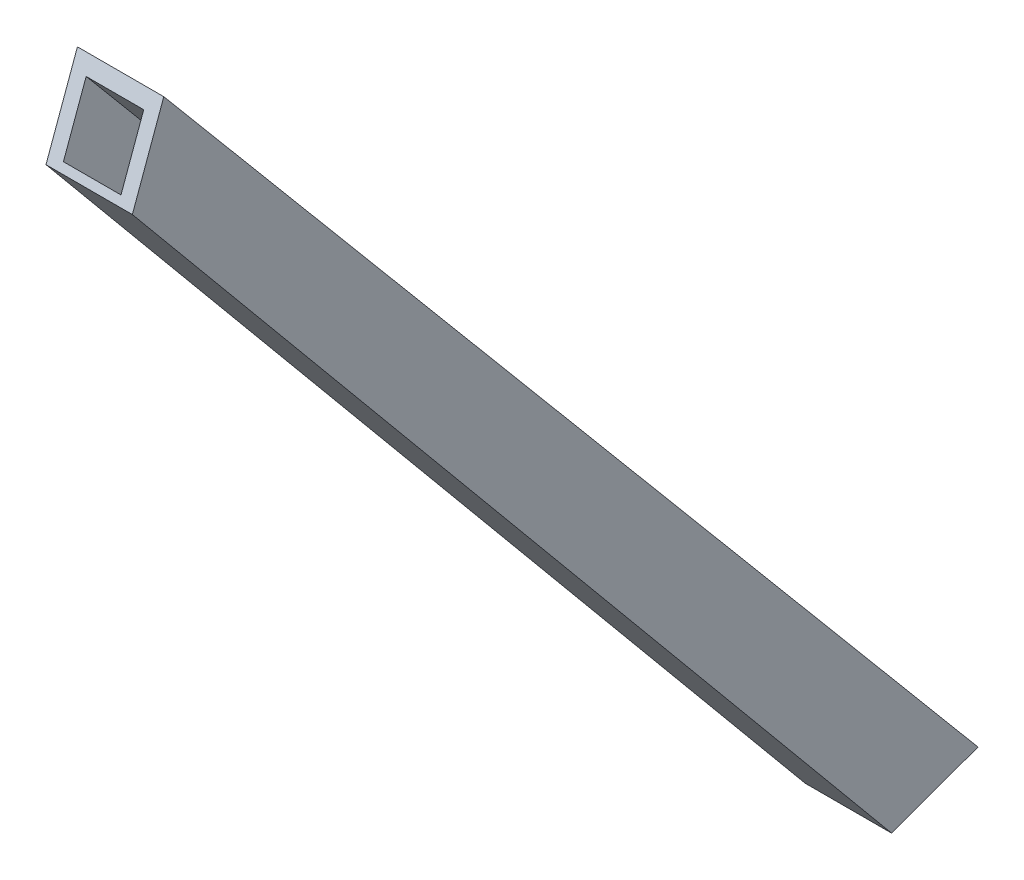
ISO-10303-21;
HEADER;
FILE_DESCRIPTION(('STEP AP214'),'2;1');
FILE_NAME('part.step','',(''),(''),'','','');
FILE_SCHEMA(('AUTOMOTIVE_DESIGN { 1 0 10303 214 1 1 1 1 }'));
ENDSEC;
DATA;
#1=APPLICATION_CONTEXT('core data for automotive mechanical design processes');
#2=APPLICATION_PROTOCOL_DEFINITION('international standard','automotive_design',2000,#1);
#3=PRODUCT_CONTEXT('',#1,'mechanical');
#4=PRODUCT('Part','Part','',(#3));
#5=PRODUCT_RELATED_PRODUCT_CATEGORY('part','',(#4));
#6=PRODUCT_DEFINITION_FORMATION('','',#4);
#7=PRODUCT_DEFINITION_CONTEXT('part definition',#1,'design');
#8=PRODUCT_DEFINITION('design','',#6,#7);
#9=PRODUCT_DEFINITION_SHAPE('','',#8);
#10=(LENGTH_UNIT() NAMED_UNIT(*) SI_UNIT(.MILLI.,.METRE.));
#11=(NAMED_UNIT(*) PLANE_ANGLE_UNIT() SI_UNIT($,.RADIAN.));
#12=(NAMED_UNIT(*) SI_UNIT($,.STERADIAN.) SOLID_ANGLE_UNIT());
#13=UNCERTAINTY_MEASURE_WITH_UNIT(LENGTH_MEASURE(1.E-05),#10,'distance_accuracy_value','');
#14=(GEOMETRIC_REPRESENTATION_CONTEXT(3) GLOBAL_UNCERTAINTY_ASSIGNED_CONTEXT((#13)) GLOBAL_UNIT_ASSIGNED_CONTEXT((#10,
#11,#12)) REPRESENTATION_CONTEXT('',''));
#15=CARTESIAN_POINT('',(0.,0.,0.));
#16=DIRECTION('',(0.,0.,1.));
#17=DIRECTION('',(1.,0.,0.));
#18=AXIS2_PLACEMENT_3D('',#15,#16,#17);
#19=CARTESIAN_POINT('',(19.05,-198.741450370207,-249.444858146427));
#20=DIRECTION('',(0.,0.638416232044862,-0.769691311281114));
#21=DIRECTION('',(0.,0.769691311281114,0.638416232044862));
#22=AXIS2_PLACEMENT_3D('',#19,#20,#21);
#23=PLANE('',#22);
#24=DIRECTION('',(0.,-0.769691311281114,-0.638416232044862));
#25=VECTOR('',#24,1.);
#26=CARTESIAN_POINT('',(0.,-198.741450370207,-249.444858146427));
#27=LINE('',#26,#25);
#28=CARTESIAN_POINT('',(0.,3.175,-81.9663670372294));
#29=VERTEX_POINT('',#28);
#30=CARTESIAN_POINT('',(0.,-198.741450370207,-249.444858146427));
#31=VERTEX_POINT('',#30);
#32=EDGE_CURVE('E121',#29,#31,#27,.T.);
#33=ORIENTED_EDGE('',*,*,#32,.T.);
#34=DIRECTION('',(-1.,0.,0.));
#35=VECTOR('',#34,1.);
#36=CARTESIAN_POINT('',(19.05,-198.741450370207,-249.444858146427));
#37=LINE('',#36,#35);
#38=CARTESIAN_POINT('',(19.05,-198.741450370207,-249.444858146427));
#39=VERTEX_POINT('',#38);
#40=EDGE_CURVE('E149',#39,#31,#37,.T.);
#41=ORIENTED_EDGE('',*,*,#40,.F.);
#42=DIRECTION('',(0.,-0.769691311281114,-0.638416232044862));
#43=VECTOR('',#42,1.);
#44=CARTESIAN_POINT('',(19.05,-198.741450370207,-249.444858146427));
#45=LINE('',#44,#43);
#46=CARTESIAN_POINT('',(19.05,3.175,-81.9663670372294));
#47=VERTEX_POINT('',#46);
#48=EDGE_CURVE('E122',#47,#39,#45,.T.);
#49=ORIENTED_EDGE('',*,*,#48,.F.);
#50=DIRECTION('',(-1.,0.,0.));
#51=VECTOR('',#50,1.);
#52=CARTESIAN_POINT('',(19.05,3.175,-81.9663670372294));
#53=LINE('',#52,#51);
#54=EDGE_CURVE('E132',#47,#29,#53,.T.);
#55=ORIENTED_EDGE('',*,*,#54,.T.);
#56=EDGE_LOOP('',(#33,#41,#49,#55));
#57=FACE_BOUND('',#56,.T.);
#58=ADVANCED_FACE('F33',(#57),#23,.F.);
#59=CARTESIAN_POINT('',(19.05,-198.741450370207,-249.444858146427));
#60=DIRECTION('',(0.,0.93969262078591,0.342020143325665));
#61=DIRECTION('',(0.,-0.342020143325665,0.93969262078591));
#62=AXIS2_PLACEMENT_3D('',#59,#60,#61);
#63=PLANE('',#62);
#64=DIRECTION('',(1.,0.,0.));
#65=VECTOR('',#64,1.);
#66=CARTESIAN_POINT('',(19.05,-197.585844876412,-252.619858146427));
#67=LINE('',#66,#65);
#68=CARTESIAN_POINT('',(3.175,-197.585844876412,-252.619858146427));
#69=VERTEX_POINT('',#68);
#70=CARTESIAN_POINT('',(15.875,-197.585844876412,-252.619858146427));
#71=VERTEX_POINT('',#70);
#72=EDGE_CURVE('E94',#69,#71,#67,.T.);
#73=ORIENTED_EDGE('',*,*,#72,.T.);
#74=DIRECTION('',(0.,0.342020143325665,-0.93969262078591));
#75=VECTOR('',#74,1.);
#76=CARTESIAN_POINT('',(15.875,-198.741450370207,-249.444858146427));
#77=LINE('',#76,#75);
#78=CARTESIAN_POINT('',(15.875,-192.963422901231,-265.319858146427));
#79=VERTEX_POINT('',#78);
#80=EDGE_CURVE('E116',#71,#79,#77,.T.);
#81=ORIENTED_EDGE('',*,*,#80,.T.);
#82=DIRECTION('',(-1.,0.,0.));
#83=VECTOR('',#82,1.);
#84=CARTESIAN_POINT('',(19.05,-192.963422901231,-265.319858146427));
#85=LINE('',#84,#83);
#86=CARTESIAN_POINT('',(3.175,-192.963422901231,-265.319858146427));
#87=VERTEX_POINT('',#86);
#88=EDGE_CURVE('E114',#79,#87,#85,.T.);
#89=ORIENTED_EDGE('',*,*,#88,.T.);
#90=DIRECTION('',(0.,-0.342020143325665,0.93969262078591));
#91=VECTOR('',#90,1.);
#92=CARTESIAN_POINT('',(3.175,-198.741450370207,-249.444858146427));
#93=LINE('',#92,#91);
#94=EDGE_CURVE('E99',#87,#69,#93,.T.);
#95=ORIENTED_EDGE('',*,*,#94,.T.);
#96=EDGE_LOOP('',(#73,#81,#89,#95));
#97=FACE_BOUND('',#96,.T.);
#98=DIRECTION('',(0.,0.342020143325665,-0.93969262078591));
#99=VECTOR('',#98,1.);
#100=CARTESIAN_POINT('',(0.,-198.741450370207,-249.444858146427));
#101=LINE('',#100,#99);
#102=CARTESIAN_POINT('',(0.,-191.807817407436,-268.494858146427));
#103=VERTEX_POINT('',#102);
#104=EDGE_CURVE('E135',#31,#103,#101,.T.);
#105=ORIENTED_EDGE('',*,*,#104,.T.);
#106=DIRECTION('',(-1.,0.,0.));
#107=VECTOR('',#106,1.);
#108=CARTESIAN_POINT('',(19.05,-191.807817407436,-268.494858146427));
#109=LINE('',#108,#107);
#110=CARTESIAN_POINT('',(19.05,-191.807817407436,-268.494858146427));
#111=VERTEX_POINT('',#110);
#112=EDGE_CURVE('E146',#111,#103,#109,.T.);
#113=ORIENTED_EDGE('',*,*,#112,.F.);
#114=DIRECTION('',(0.,0.342020143325665,-0.93969262078591));
#115=VECTOR('',#114,1.);
#116=CARTESIAN_POINT('',(19.05,-198.741450370207,-249.444858146427));
#117=LINE('',#116,#115);
#118=EDGE_CURVE('E125',#39,#111,#117,.T.);
#119=ORIENTED_EDGE('',*,*,#118,.F.);
#120=ORIENTED_EDGE('',*,*,#40,.T.);
#121=EDGE_LOOP('',(#105,#113,#119,#120));
#122=FACE_BOUND('',#121,.T.);
#123=ADVANCED_FACE('F112',(#97,#122),#63,.F.);
#124=CARTESIAN_POINT('',(19.05,15.420103964529,-94.6099857535639));
#125=DIRECTION('',(0.,-0.642787609686569,0.766044443118953));
#126=DIRECTION('',(0.,-0.766044443118953,-0.642787609686569));
#127=AXIS2_PLACEMENT_3D('',#124,#125,#126);
#128=PLANE('',#127);
#129=DIRECTION('',(0.,0.766044443118953,0.642787609686569));
#130=VECTOR('',#129,1.);
#131=CARTESIAN_POINT('',(0.,15.420103964529,-94.6099857535639));
#132=LINE('',#131,#130);
#133=CARTESIAN_POINT('',(0.,22.225,-88.9));
#134=VERTEX_POINT('',#133);
#135=EDGE_CURVE('E138',#103,#134,#132,.T.);
#136=ORIENTED_EDGE('',*,*,#135,.T.);
#137=DIRECTION('',(-1.,0.,0.));
#138=VECTOR('',#137,1.);
#139=CARTESIAN_POINT('',(19.05,22.225,-88.9));
#140=LINE('',#139,#138);
#141=CARTESIAN_POINT('',(19.05,22.225,-88.9));
#142=VERTEX_POINT('',#141);
#143=EDGE_CURVE('E143',#142,#134,#140,.T.);
#144=ORIENTED_EDGE('',*,*,#143,.F.);
#145=DIRECTION('',(0.,0.766044443118954,0.642787609686568));
#146=VECTOR('',#145,1.);
#147=CARTESIAN_POINT('',(19.05,15.420103964529,-94.6099857535639));
#148=LINE('',#147,#146);
#149=EDGE_CURVE('E128',#111,#142,#148,.T.);
#150=ORIENTED_EDGE('',*,*,#149,.F.);
#151=ORIENTED_EDGE('',*,*,#112,.T.);
#152=EDGE_LOOP('',(#136,#144,#150,#151));
#153=FACE_BOUND('',#152,.T.);
#154=ADVANCED_FACE('F184',(#153),#128,.F.);
#155=CARTESIAN_POINT('',(19.05,22.225,-88.9));
#156=DIRECTION('',(0.,-0.342020143325644,-0.939692620785917));
#157=DIRECTION('',(0.,0.939692620785918,-0.342020143325644));
#158=AXIS2_PLACEMENT_3D('',#155,#156,#157);
#159=PLANE('',#158);
#160=DIRECTION('',(1.,0.,0.));
#161=VECTOR('',#160,1.);
#162=CARTESIAN_POINT('',(19.05,18.7799231489541,-87.6460945714598));
#163=LINE('',#162,#161);
#164=CARTESIAN_POINT('',(3.175,18.7799231489541,-87.6460945714598));
#165=VERTEX_POINT('',#164);
#166=CARTESIAN_POINT('',(15.875,18.7799231489541,-87.6460945714598));
#167=VERTEX_POINT('',#166);
#168=EDGE_CURVE('E40',#165,#167,#163,.T.);
#169=ORIENTED_EDGE('',*,*,#168,.T.);
#170=DIRECTION('',(0.,-0.939692620785918,0.342020143325644));
#171=VECTOR('',#170,1.);
#172=CARTESIAN_POINT('',(15.875,22.225,-88.9));
#173=LINE('',#172,#171);
#174=CARTESIAN_POINT('',(15.875,4.99961574477128,-82.6304728572996));
#175=VERTEX_POINT('',#174);
#176=EDGE_CURVE('E11',#167,#175,#173,.T.);
#177=ORIENTED_EDGE('',*,*,#176,.T.);
#178=DIRECTION('',(-1.,0.,0.));
#179=VECTOR('',#178,1.);
#180=CARTESIAN_POINT('',(19.05,4.99961574477128,-82.6304728572996));
#181=LINE('',#180,#179);
#182=CARTESIAN_POINT('',(3.175,4.99961574477128,-82.6304728572996));
#183=VERTEX_POINT('',#182);
#184=EDGE_CURVE('E152',#175,#183,#181,.T.);
#185=ORIENTED_EDGE('',*,*,#184,.T.);
#186=DIRECTION('',(0.,0.939692620785918,-0.342020143325644));
#187=VECTOR('',#186,1.);
#188=CARTESIAN_POINT('',(3.175,22.225,-88.9));
#189=LINE('',#188,#187);
#190=EDGE_CURVE('E107',#183,#165,#189,.T.);
#191=ORIENTED_EDGE('',*,*,#190,.T.);
#192=EDGE_LOOP('',(#169,#177,#185,#191));
#193=FACE_BOUND('',#192,.T.);
#194=DIRECTION('',(0.,-0.939692620785917,0.342020143325644));
#195=VECTOR('',#194,1.);
#196=CARTESIAN_POINT('',(0.,22.225,-88.9));
#197=LINE('',#196,#195);
#198=EDGE_CURVE('E126',#134,#29,#197,.T.);
#199=ORIENTED_EDGE('',*,*,#198,.T.);
#200=ORIENTED_EDGE('',*,*,#54,.F.);
#201=DIRECTION('',(0.,-0.939692620785917,0.342020143325644));
#202=VECTOR('',#201,1.);
#203=CARTESIAN_POINT('',(19.05,22.225,-88.9));
#204=LINE('',#203,#202);
#205=EDGE_CURVE('E130',#142,#47,#204,.T.);
#206=ORIENTED_EDGE('',*,*,#205,.F.);
#207=ORIENTED_EDGE('',*,*,#143,.T.);
#208=EDGE_LOOP('',(#199,#200,#206,#207));
#209=FACE_BOUND('',#208,.T.);
#210=ADVANCED_FACE('F156',(#193,#209),#159,.F.);
#211=CARTESIAN_POINT('',(19.05,0.,0.));
#212=DIRECTION('',(-1.,0.,0.));
#213=DIRECTION('',(0.,0.,1.));
#214=AXIS2_PLACEMENT_3D('',#211,#212,#213);
#215=PLANE('',#214);
#216=ORIENTED_EDGE('',*,*,#48,.T.);
#217=ORIENTED_EDGE('',*,*,#118,.T.);
#218=ORIENTED_EDGE('',*,*,#149,.T.);
#219=ORIENTED_EDGE('',*,*,#205,.T.);
#220=EDGE_LOOP('',(#216,#217,#218,#219));
#221=FACE_BOUND('',#220,.T.);
#222=ADVANCED_FACE('F174',(#221),#215,.F.);
#223=CARTESIAN_POINT('',(0.,0.,0.));
#224=DIRECTION('',(-1.,0.,0.));
#225=DIRECTION('',(0.,0.,1.));
#226=AXIS2_PLACEMENT_3D('',#223,#224,#225);
#227=PLANE('',#226);
#228=ORIENTED_EDGE('',*,*,#32,.F.);
#229=ORIENTED_EDGE('',*,*,#198,.F.);
#230=ORIENTED_EDGE('',*,*,#135,.F.);
#231=ORIENTED_EDGE('',*,*,#104,.F.);
#232=EDGE_LOOP('',(#228,#229,#230,#231));
#233=FACE_BOUND('',#232,.T.);
#234=ADVANCED_FACE('F167',(#233),#227,.T.);
#235=CARTESIAN_POINT('',(15.875,15.4348944453644,-73.8742343483991));
#236=DIRECTION('',(1.,0.,0.));
#237=DIRECTION('',(0.,0.,-1.));
#238=AXIS2_PLACEMENT_3D('',#235,#236,#237);
#239=PLANE('',#238);
#240=DIRECTION('',(0.,-0.766044443118953,-0.642787609686569));
#241=VECTOR('',#240,1.);
#242=CARTESIAN_POINT('',(15.875,15.4348944453644,-73.8742343483991));
#243=LINE('',#242,#241);
#244=EDGE_CURVE('E47',#175,#71,#243,.T.);
#245=ORIENTED_EDGE('',*,*,#244,.F.);
#246=ORIENTED_EDGE('',*,*,#176,.F.);
#247=DIRECTION('',(0.,-0.766044443118953,-0.642787609686569));
#248=VECTOR('',#247,1.);
#249=CARTESIAN_POINT('',(15.875,23.5982970883838,-83.6029987760098));
#250=LINE('',#249,#248);
#251=EDGE_CURVE('E100',#167,#79,#250,.T.);
#252=ORIENTED_EDGE('',*,*,#251,.T.);
#253=ORIENTED_EDGE('',*,*,#80,.F.);
#254=EDGE_LOOP('',(#245,#246,#252,#253));
#255=FACE_BOUND('',#254,.T.);
#256=ADVANCED_FACE('F165',(#255),#239,.F.);
#257=CARTESIAN_POINT('',(3.175,23.5982970883838,-83.6029987760098));
#258=DIRECTION('',(0.,0.642787609686569,-0.766044443118953));
#259=DIRECTION('',(0.,0.766044443118953,0.642787609686569));
#260=AXIS2_PLACEMENT_3D('',#257,#258,#259);
#261=PLANE('',#260);
#262=ORIENTED_EDGE('',*,*,#251,.F.);
#263=ORIENTED_EDGE('',*,*,#168,.F.);
#264=DIRECTION('',(0.,-0.766044443118953,-0.642787609686569));
#265=VECTOR('',#264,1.);
#266=CARTESIAN_POINT('',(3.175,23.5982970883838,-83.6029987760098));
#267=LINE('',#266,#265);
#268=EDGE_CURVE('E109',#165,#87,#267,.T.);
#269=ORIENTED_EDGE('',*,*,#268,.T.);
#270=ORIENTED_EDGE('',*,*,#88,.F.);
#271=EDGE_LOOP('',(#262,#263,#269,#270));
#272=FACE_BOUND('',#271,.T.);
#273=ADVANCED_FACE('F160',(#272),#261,.F.);
#274=CARTESIAN_POINT('',(3.175,15.4348944453644,-73.8742343483991));
#275=DIRECTION('',(-1.,0.,0.));
#276=DIRECTION('',(0.,0.,1.));
#277=AXIS2_PLACEMENT_3D('',#274,#275,#276);
#278=PLANE('',#277);
#279=ORIENTED_EDGE('',*,*,#268,.F.);
#280=ORIENTED_EDGE('',*,*,#190,.F.);
#281=DIRECTION('',(0.,-0.766044443118953,-0.642787609686569));
#282=VECTOR('',#281,1.);
#283=CARTESIAN_POINT('',(3.175,15.4348944453644,-73.8742343483991));
#284=LINE('',#283,#282);
#285=EDGE_CURVE('E52',#183,#69,#284,.T.);
#286=ORIENTED_EDGE('',*,*,#285,.T.);
#287=ORIENTED_EDGE('',*,*,#94,.F.);
#288=EDGE_LOOP('',(#279,#280,#286,#287));
#289=FACE_BOUND('',#288,.T.);
#290=ADVANCED_FACE('F104',(#289),#278,.F.);
#291=CARTESIAN_POINT('',(3.175,15.4348944453644,-73.8742343483991));
#292=DIRECTION('',(0.,-0.642787609686569,0.766044443118953));
#293=DIRECTION('',(0.,-0.766044443118953,-0.642787609686569));
#294=AXIS2_PLACEMENT_3D('',#291,#292,#293);
#295=PLANE('',#294);
#296=ORIENTED_EDGE('',*,*,#285,.F.);
#297=ORIENTED_EDGE('',*,*,#184,.F.);
#298=ORIENTED_EDGE('',*,*,#244,.T.);
#299=ORIENTED_EDGE('',*,*,#72,.F.);
#300=EDGE_LOOP('',(#296,#297,#298,#299));
#301=FACE_BOUND('',#300,.T.);
#302=ADVANCED_FACE('F95',(#301),#295,.F.);
#303=CLOSED_SHELL('',(#58,#123,#154,#210,#222,#234,#256,#273,#290,#302));
#304=MANIFOLD_SOLID_BREP('B2',#303);
#305=ADVANCED_BREP_SHAPE_REPRESENTATION('',(#18,#304),#14);
#306=SHAPE_DEFINITION_REPRESENTATION(#9,#305);
ENDSEC;
END-ISO-10303-21;
